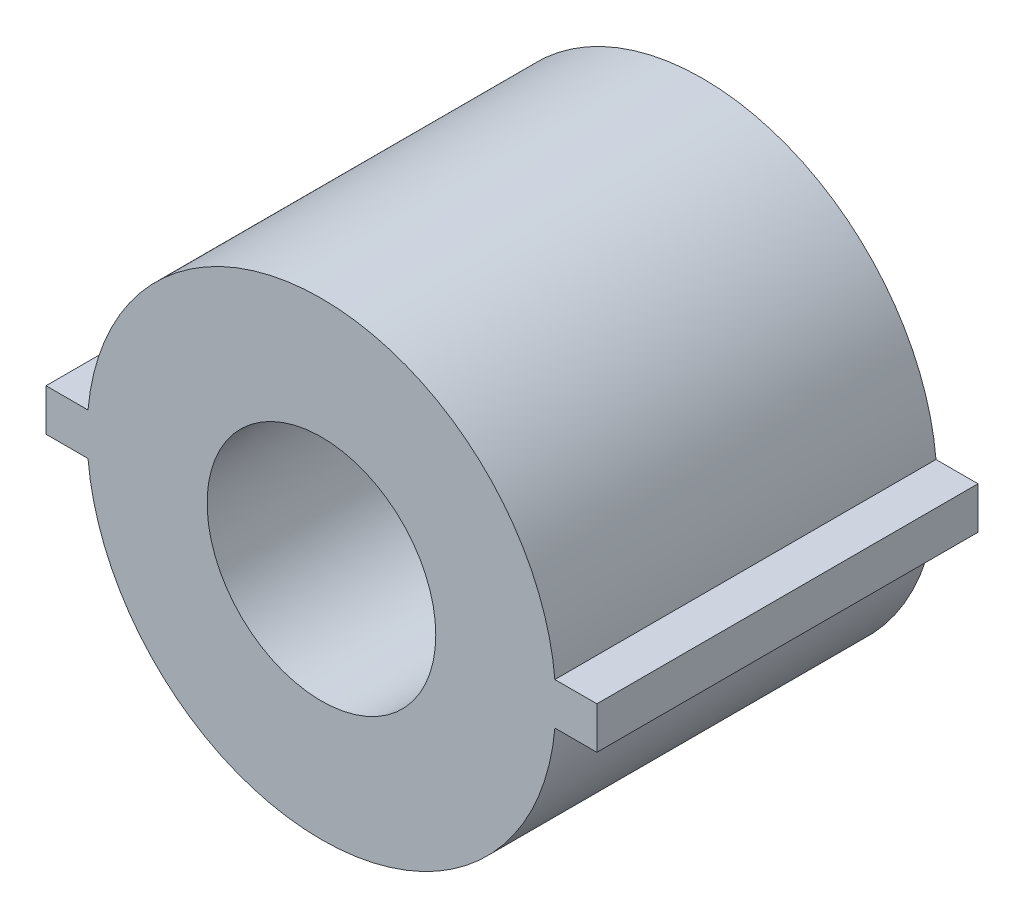
ISO-10303-21;
HEADER;
FILE_DESCRIPTION(('STEP AP214'),'2;1');
FILE_NAME('part.step','',(''),(''),'','','');
FILE_SCHEMA(('AUTOMOTIVE_DESIGN { 1 0 10303 214 1 1 1 1 }'));
ENDSEC;
DATA;
#1=APPLICATION_CONTEXT('core data for automotive mechanical design processes');
#2=APPLICATION_PROTOCOL_DEFINITION('international standard','automotive_design',2000,#1);
#3=PRODUCT_CONTEXT('',#1,'mechanical');
#4=PRODUCT('Part','Part','',(#3));
#5=PRODUCT_RELATED_PRODUCT_CATEGORY('part','',(#4));
#6=PRODUCT_DEFINITION_FORMATION('','',#4);
#7=PRODUCT_DEFINITION_CONTEXT('part definition',#1,'design');
#8=PRODUCT_DEFINITION('design','',#6,#7);
#9=PRODUCT_DEFINITION_SHAPE('','',#8);
#10=(LENGTH_UNIT() NAMED_UNIT(*) SI_UNIT(.MILLI.,.METRE.));
#11=(NAMED_UNIT(*) PLANE_ANGLE_UNIT() SI_UNIT($,.RADIAN.));
#12=(NAMED_UNIT(*) SI_UNIT($,.STERADIAN.) SOLID_ANGLE_UNIT());
#13=UNCERTAINTY_MEASURE_WITH_UNIT(LENGTH_MEASURE(1.E-05),#10,'distance_accuracy_value','');
#14=(GEOMETRIC_REPRESENTATION_CONTEXT(3) GLOBAL_UNCERTAINTY_ASSIGNED_CONTEXT((#13)) GLOBAL_UNIT_ASSIGNED_CONTEXT((#10,
#11,#12)) REPRESENTATION_CONTEXT('',''));
#15=CARTESIAN_POINT('',(0.,0.,0.));
#16=DIRECTION('',(0.,0.,1.));
#17=DIRECTION('',(1.,0.,0.));
#18=AXIS2_PLACEMENT_3D('',#15,#16,#17);
#19=CARTESIAN_POINT('',(0.,0.,6.35));
#20=DIRECTION('',(0.,0.,-1.));
#21=DIRECTION('',(-1.,0.,0.));
#22=AXIS2_PLACEMENT_3D('',#19,#20,#21);
#23=CYLINDRICAL_SURFACE('',#22,3.905);
#24=CARTESIAN_POINT('',(0.,0.,6.35));
#25=DIRECTION('',(0.,0.,1.));
#26=DIRECTION('',(1.,0.,0.));
#27=AXIS2_PLACEMENT_3D('',#24,#25,#26);
#28=CIRCLE('',#27,3.905);
#29=CARTESIAN_POINT('',(-3.88928335300991,-0.350000000000001,6.35));
#30=VERTEX_POINT('',#29);
#31=CARTESIAN_POINT('',(3.88928335300991,-0.349999999999999,6.35));
#32=VERTEX_POINT('',#31);
#33=EDGE_CURVE('E42',#30,#32,#28,.T.);
#34=ORIENTED_EDGE('',*,*,#33,.F.);
#35=DIRECTION('',(0.,0.,-1.));
#36=VECTOR('',#35,1.);
#37=CARTESIAN_POINT('',(-3.88928335300991,-0.35,6.35));
#38=LINE('',#37,#36);
#39=CARTESIAN_POINT('',(-3.88928335300991,-0.35,0.));
#40=VERTEX_POINT('',#39);
#41=EDGE_CURVE('E120',#30,#40,#38,.T.);
#42=ORIENTED_EDGE('',*,*,#41,.T.);
#43=CARTESIAN_POINT('',(0.,0.,0.));
#44=DIRECTION('',(0.,0.,1.));
#45=DIRECTION('',(1.,0.,0.));
#46=AXIS2_PLACEMENT_3D('',#43,#44,#45);
#47=CIRCLE('',#46,3.905);
#48=CARTESIAN_POINT('',(3.88928335300991,-0.350000000000001,0.));
#49=VERTEX_POINT('',#48);
#50=EDGE_CURVE('E165',#40,#49,#47,.T.);
#51=ORIENTED_EDGE('',*,*,#50,.T.);
#52=DIRECTION('',(0.,0.,-1.));
#53=VECTOR('',#52,1.);
#54=CARTESIAN_POINT('',(3.88928335300991,-0.349999999999999,6.35));
#55=LINE('',#54,#53);
#56=EDGE_CURVE('E158',#32,#49,#55,.T.);
#57=ORIENTED_EDGE('',*,*,#56,.F.);
#58=EDGE_LOOP('',(#34,#42,#51,#57));
#59=FACE_BOUND('',#58,.T.);
#60=ADVANCED_FACE('F33',(#59),#23,.T.);
#61=CARTESIAN_POINT('',(0.,0.,6.35));
#62=DIRECTION('',(0.,0.,1.));
#63=DIRECTION('',(1.,0.,0.));
#64=AXIS2_PLACEMENT_3D('',#61,#62,#63);
#65=PLANE('',#64);
#66=CARTESIAN_POINT('',(3.88928335300991,0.349999999999999,6.35));
#67=VERTEX_POINT('',#66);
#68=CARTESIAN_POINT('',(-3.88928335300991,0.35,6.35));
#69=VERTEX_POINT('',#68);
#70=EDGE_CURVE('E11',#67,#69,#28,.T.);
#71=ORIENTED_EDGE('',*,*,#70,.T.);
#72=DIRECTION('',(1.,0.,0.));
#73=VECTOR('',#72,1.);
#74=CARTESIAN_POINT('',(-4.58928335300991,0.35,6.35));
#75=LINE('',#74,#73);
#76=CARTESIAN_POINT('',(-4.58928335300991,0.35,6.35));
#77=VERTEX_POINT('',#76);
#78=EDGE_CURVE('E109',#77,#69,#75,.T.);
#79=ORIENTED_EDGE('',*,*,#78,.F.);
#80=DIRECTION('',(0.,1.,0.));
#81=VECTOR('',#80,1.);
#82=CARTESIAN_POINT('',(-4.58928335300991,0.35,6.35));
#83=LINE('',#82,#81);
#84=CARTESIAN_POINT('',(-4.58928335300991,-0.35,6.35));
#85=VERTEX_POINT('',#84);
#86=EDGE_CURVE('E101',#85,#77,#83,.T.);
#87=ORIENTED_EDGE('',*,*,#86,.F.);
#88=DIRECTION('',(-1.,0.,0.));
#89=VECTOR('',#88,1.);
#90=CARTESIAN_POINT('',(-4.58928335300991,-0.35,6.35));
#91=LINE('',#90,#89);
#92=EDGE_CURVE('E116',#30,#85,#91,.T.);
#93=ORIENTED_EDGE('',*,*,#92,.F.);
#94=ORIENTED_EDGE('',*,*,#33,.T.);
#95=DIRECTION('',(-1.,0.,0.));
#96=VECTOR('',#95,1.);
#97=CARTESIAN_POINT('',(4.58928335300991,-0.349999999999999,6.35));
#98=LINE('',#97,#96);
#99=CARTESIAN_POINT('',(4.58928335300991,-0.349999999999999,6.35));
#100=VERTEX_POINT('',#99);
#101=EDGE_CURVE('E138',#100,#32,#98,.T.);
#102=ORIENTED_EDGE('',*,*,#101,.F.);
#103=DIRECTION('',(0.,-1.,0.));
#104=VECTOR('',#103,1.);
#105=CARTESIAN_POINT('',(4.58928335300991,0.349999999999999,6.35));
#106=LINE('',#105,#104);
#107=CARTESIAN_POINT('',(4.58928335300991,0.349999999999999,6.35));
#108=VERTEX_POINT('',#107);
#109=EDGE_CURVE('E135',#108,#100,#106,.T.);
#110=ORIENTED_EDGE('',*,*,#109,.F.);
#111=DIRECTION('',(1.,0.,0.));
#112=VECTOR('',#111,1.);
#113=CARTESIAN_POINT('',(4.58928335300991,0.349999999999999,6.35));
#114=LINE('',#113,#112);
#115=EDGE_CURVE('E142',#67,#108,#114,.T.);
#116=ORIENTED_EDGE('',*,*,#115,.F.);
#117=EDGE_LOOP('',(#71,#79,#87,#93,#94,#102,#110,#116));
#118=FACE_BOUND('',#117,.T.);
#119=CARTESIAN_POINT('',(0.,0.,6.35));
#120=DIRECTION('',(0.,0.,1.));
#121=DIRECTION('',(1.,0.,0.));
#122=AXIS2_PLACEMENT_3D('',#119,#120,#121);
#123=CIRCLE('',#122,1.905);
#124=CARTESIAN_POINT('',(1.905,0.,6.35));
#125=VERTEX_POINT('',#124);
#126=EDGE_CURVE('E162',#125,#125,#123,.T.);
#127=ORIENTED_EDGE('',*,*,#126,.F.);
#128=EDGE_LOOP('',(#127));
#129=FACE_BOUND('',#128,.T.);
#130=ADVANCED_FACE('F114',(#118,#129),#65,.T.);
#131=CARTESIAN_POINT('',(0.,0.,0.));
#132=DIRECTION('',(0.,0.,1.));
#133=DIRECTION('',(1.,0.,0.));
#134=AXIS2_PLACEMENT_3D('',#131,#132,#133);
#135=PLANE('',#134);
#136=ORIENTED_EDGE('',*,*,#50,.F.);
#137=DIRECTION('',(-1.,0.,0.));
#138=VECTOR('',#137,1.);
#139=CARTESIAN_POINT('',(-4.58928335300991,-0.35,0.));
#140=LINE('',#139,#138);
#141=CARTESIAN_POINT('',(-4.58928335300991,-0.35,0.));
#142=VERTEX_POINT('',#141);
#143=EDGE_CURVE('E127',#40,#142,#140,.T.);
#144=ORIENTED_EDGE('',*,*,#143,.T.);
#145=DIRECTION('',(0.,1.,0.));
#146=VECTOR('',#145,1.);
#147=CARTESIAN_POINT('',(-4.58928335300991,0.35,0.));
#148=LINE('',#147,#146);
#149=CARTESIAN_POINT('',(-4.58928335300991,0.35,0.));
#150=VERTEX_POINT('',#149);
#151=EDGE_CURVE('E103',#142,#150,#148,.T.);
#152=ORIENTED_EDGE('',*,*,#151,.T.);
#153=DIRECTION('',(1.,0.,0.));
#154=VECTOR('',#153,1.);
#155=CARTESIAN_POINT('',(-4.58928335300991,0.35,0.));
#156=LINE('',#155,#154);
#157=CARTESIAN_POINT('',(-3.88928335300991,0.350000000000001,0.));
#158=VERTEX_POINT('',#157);
#159=EDGE_CURVE('E121',#150,#158,#156,.T.);
#160=ORIENTED_EDGE('',*,*,#159,.T.);
#161=CARTESIAN_POINT('',(3.88928335300991,0.349999999999999,0.));
#162=VERTEX_POINT('',#161);
#163=EDGE_CURVE('E37',#162,#158,#47,.T.);
#164=ORIENTED_EDGE('',*,*,#163,.F.);
#165=DIRECTION('',(1.,0.,0.));
#166=VECTOR('',#165,1.);
#167=CARTESIAN_POINT('',(4.58928335300991,0.349999999999999,0.));
#168=LINE('',#167,#166);
#169=CARTESIAN_POINT('',(4.58928335300991,0.349999999999999,0.));
#170=VERTEX_POINT('',#169);
#171=EDGE_CURVE('E139',#162,#170,#168,.T.);
#172=ORIENTED_EDGE('',*,*,#171,.T.);
#173=DIRECTION('',(0.,-1.,0.));
#174=VECTOR('',#173,1.);
#175=CARTESIAN_POINT('',(4.58928335300991,0.349999999999999,0.));
#176=LINE('',#175,#174);
#177=CARTESIAN_POINT('',(4.58928335300991,-0.349999999999999,0.));
#178=VERTEX_POINT('',#177);
#179=EDGE_CURVE('E131',#170,#178,#176,.T.);
#180=ORIENTED_EDGE('',*,*,#179,.T.);
#181=DIRECTION('',(-1.,0.,0.));
#182=VECTOR('',#181,1.);
#183=CARTESIAN_POINT('',(4.58928335300991,-0.349999999999999,0.));
#184=LINE('',#183,#182);
#185=EDGE_CURVE('E148',#178,#49,#184,.T.);
#186=ORIENTED_EDGE('',*,*,#185,.T.);
#187=EDGE_LOOP('',(#136,#144,#152,#160,#164,#172,#180,#186));
#188=FACE_BOUND('',#187,.T.);
#189=CARTESIAN_POINT('',(0.,0.,0.));
#190=DIRECTION('',(0.,0.,1.));
#191=DIRECTION('',(1.,0.,0.));
#192=AXIS2_PLACEMENT_3D('',#189,#190,#191);
#193=CIRCLE('',#192,1.905);
#194=CARTESIAN_POINT('',(1.905,0.,0.));
#195=VERTEX_POINT('',#194);
#196=EDGE_CURVE('E155',#195,#195,#193,.T.);
#197=ORIENTED_EDGE('',*,*,#196,.T.);
#198=EDGE_LOOP('',(#197));
#199=FACE_BOUND('',#198,.T.);
#200=ADVANCED_FACE('F169',(#188,#199),#135,.F.);
#201=ORIENTED_EDGE('',*,*,#163,.T.);
#202=DIRECTION('',(0.,0.,-1.));
#203=VECTOR('',#202,1.);
#204=CARTESIAN_POINT('',(-3.88928335300991,0.35,6.35));
#205=LINE('',#204,#203);
#206=EDGE_CURVE('E132',#69,#158,#205,.T.);
#207=ORIENTED_EDGE('',*,*,#206,.F.);
#208=ORIENTED_EDGE('',*,*,#70,.F.);
#209=DIRECTION('',(0.,0.,-1.));
#210=VECTOR('',#209,1.);
#211=CARTESIAN_POINT('',(3.88928335300991,0.349999999999999,6.35));
#212=LINE('',#211,#210);
#213=EDGE_CURVE('E156',#67,#162,#212,.T.);
#214=ORIENTED_EDGE('',*,*,#213,.T.);
#215=EDGE_LOOP('',(#201,#207,#208,#214));
#216=FACE_BOUND('',#215,.T.);
#217=ADVANCED_FACE('F35',(#216),#23,.T.);
#218=CARTESIAN_POINT('',(0.,0.,6.35));
#219=DIRECTION('',(0.,0.,-1.));
#220=DIRECTION('',(-1.,0.,0.));
#221=AXIS2_PLACEMENT_3D('',#218,#219,#220);
#222=CYLINDRICAL_SURFACE('',#221,1.905);
#223=ORIENTED_EDGE('',*,*,#126,.T.);
#224=EDGE_LOOP('',(#223));
#225=FACE_BOUND('',#224,.T.);
#226=ORIENTED_EDGE('',*,*,#196,.F.);
#227=EDGE_LOOP('',(#226));
#228=FACE_BOUND('',#227,.T.);
#229=ADVANCED_FACE('F171',(#225,#228),#222,.F.);
#230=CARTESIAN_POINT('',(4.58928335300991,0.349999999999999,6.35));
#231=DIRECTION('',(1.,0.,0.));
#232=DIRECTION('',(0.,0.,-1.));
#233=AXIS2_PLACEMENT_3D('',#230,#231,#232);
#234=PLANE('',#233);
#235=ORIENTED_EDGE('',*,*,#179,.F.);
#236=DIRECTION('',(0.,0.,-1.));
#237=VECTOR('',#236,1.);
#238=CARTESIAN_POINT('',(4.58928335300991,0.349999999999999,6.35));
#239=LINE('',#238,#237);
#240=EDGE_CURVE('E153',#108,#170,#239,.T.);
#241=ORIENTED_EDGE('',*,*,#240,.F.);
#242=ORIENTED_EDGE('',*,*,#109,.T.);
#243=DIRECTION('',(0.,0.,-1.));
#244=VECTOR('',#243,1.);
#245=CARTESIAN_POINT('',(4.58928335300991,-0.349999999999999,6.35));
#246=LINE('',#245,#244);
#247=EDGE_CURVE('E145',#100,#178,#246,.T.);
#248=ORIENTED_EDGE('',*,*,#247,.T.);
#249=EDGE_LOOP('',(#235,#241,#242,#248));
#250=FACE_BOUND('',#249,.T.);
#251=ADVANCED_FACE('F173',(#250),#234,.T.);
#252=CARTESIAN_POINT('',(4.58928335300991,0.349999999999999,6.35));
#253=DIRECTION('',(0.,1.,0.));
#254=DIRECTION('',(-1.,0.,0.));
#255=AXIS2_PLACEMENT_3D('',#252,#253,#254);
#256=PLANE('',#255);
#257=ORIENTED_EDGE('',*,*,#171,.F.);
#258=ORIENTED_EDGE('',*,*,#213,.F.);
#259=ORIENTED_EDGE('',*,*,#115,.T.);
#260=ORIENTED_EDGE('',*,*,#240,.T.);
#261=EDGE_LOOP('',(#257,#258,#259,#260));
#262=FACE_BOUND('',#261,.T.);
#263=ADVANCED_FACE('F180',(#262),#256,.T.);
#264=CARTESIAN_POINT('',(4.58928335300991,-0.349999999999999,6.35));
#265=DIRECTION('',(0.,-1.,0.));
#266=DIRECTION('',(1.,0.,0.));
#267=AXIS2_PLACEMENT_3D('',#264,#265,#266);
#268=PLANE('',#267);
#269=ORIENTED_EDGE('',*,*,#185,.F.);
#270=ORIENTED_EDGE('',*,*,#247,.F.);
#271=ORIENTED_EDGE('',*,*,#101,.T.);
#272=ORIENTED_EDGE('',*,*,#56,.T.);
#273=EDGE_LOOP('',(#269,#270,#271,#272));
#274=FACE_BOUND('',#273,.T.);
#275=ADVANCED_FACE('F198',(#274),#268,.T.);
#276=CARTESIAN_POINT('',(-4.58928335300991,-0.35,6.35));
#277=DIRECTION('',(0.,-1.,0.));
#278=DIRECTION('',(1.,0.,0.));
#279=AXIS2_PLACEMENT_3D('',#276,#277,#278);
#280=PLANE('',#279);
#281=ORIENTED_EDGE('',*,*,#143,.F.);
#282=ORIENTED_EDGE('',*,*,#41,.F.);
#283=ORIENTED_EDGE('',*,*,#92,.T.);
#284=DIRECTION('',(0.,0.,-1.));
#285=VECTOR('',#284,1.);
#286=CARTESIAN_POINT('',(-4.58928335300991,-0.35,6.35));
#287=LINE('',#286,#285);
#288=EDGE_CURVE('E98',#85,#142,#287,.T.);
#289=ORIENTED_EDGE('',*,*,#288,.T.);
#290=EDGE_LOOP('',(#281,#282,#283,#289));
#291=FACE_BOUND('',#290,.T.);
#292=ADVANCED_FACE('F119',(#291),#280,.T.);
#293=CARTESIAN_POINT('',(-4.58928335300991,0.35,6.35));
#294=DIRECTION('',(0.,1.,0.));
#295=DIRECTION('',(-1.,0.,0.));
#296=AXIS2_PLACEMENT_3D('',#293,#294,#295);
#297=PLANE('',#296);
#298=ORIENTED_EDGE('',*,*,#159,.F.);
#299=DIRECTION('',(0.,0.,-1.));
#300=VECTOR('',#299,1.);
#301=CARTESIAN_POINT('',(-4.58928335300991,0.35,6.35));
#302=LINE('',#301,#300);
#303=EDGE_CURVE('E108',#77,#150,#302,.T.);
#304=ORIENTED_EDGE('',*,*,#303,.F.);
#305=ORIENTED_EDGE('',*,*,#78,.T.);
#306=ORIENTED_EDGE('',*,*,#206,.T.);
#307=EDGE_LOOP('',(#298,#304,#305,#306));
#308=FACE_BOUND('',#307,.T.);
#309=ADVANCED_FACE('F206',(#308),#297,.T.);
#310=CARTESIAN_POINT('',(-4.58928335300991,0.35,6.35));
#311=DIRECTION('',(-1.,0.,0.));
#312=DIRECTION('',(0.,0.,1.));
#313=AXIS2_PLACEMENT_3D('',#310,#311,#312);
#314=PLANE('',#313);
#315=ORIENTED_EDGE('',*,*,#151,.F.);
#316=ORIENTED_EDGE('',*,*,#288,.F.);
#317=ORIENTED_EDGE('',*,*,#86,.T.);
#318=ORIENTED_EDGE('',*,*,#303,.T.);
#319=EDGE_LOOP('',(#315,#316,#317,#318));
#320=FACE_BOUND('',#319,.T.);
#321=ADVANCED_FACE('F100',(#320),#314,.T.);
#322=CLOSED_SHELL('',(#60,#130,#200,#217,#229,#251,#263,#275,#292,#309,#321));
#323=MANIFOLD_SOLID_BREP('B2',#322);
#324=ADVANCED_BREP_SHAPE_REPRESENTATION('',(#18,#323),#14);
#325=SHAPE_DEFINITION_REPRESENTATION(#9,#324);
ENDSEC;
END-ISO-10303-21;
